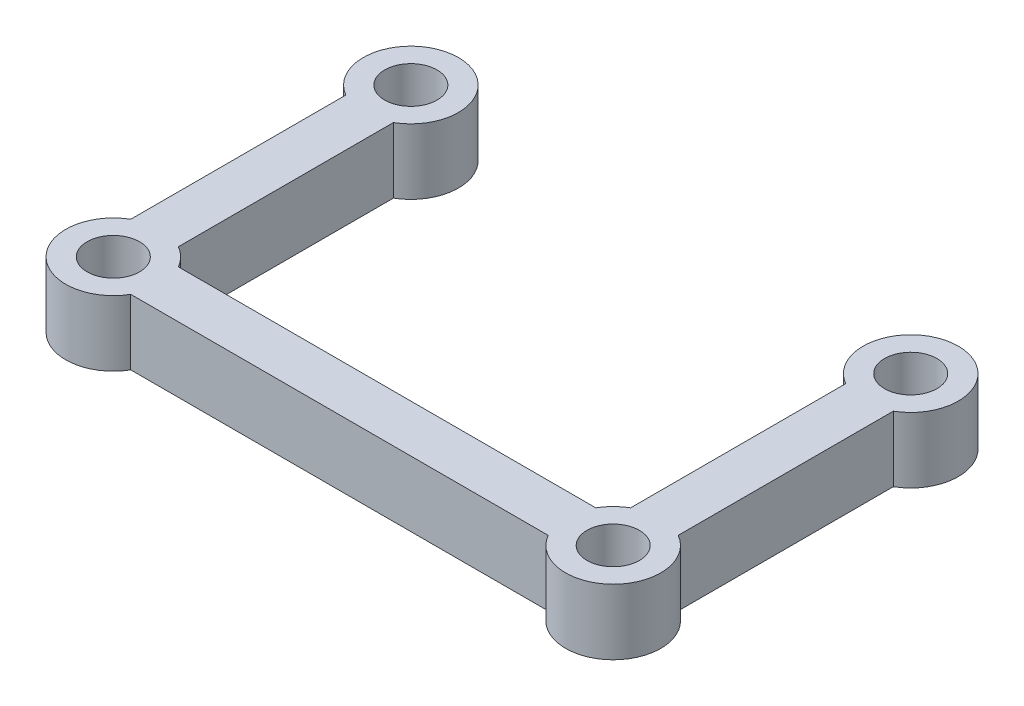
ISO-10303-21;
HEADER;
FILE_DESCRIPTION(('STEP AP214'),'2;1');
FILE_NAME('part.step','',(''),(''),'','','');
FILE_SCHEMA(('AUTOMOTIVE_DESIGN { 1 0 10303 214 1 1 1 1 }'));
ENDSEC;
DATA;
#1=APPLICATION_CONTEXT('core data for automotive mechanical design processes');
#2=APPLICATION_PROTOCOL_DEFINITION('international standard','automotive_design',2000,#1);
#3=PRODUCT_CONTEXT('',#1,'mechanical');
#4=PRODUCT('Part','Part','',(#3));
#5=PRODUCT_RELATED_PRODUCT_CATEGORY('part','',(#4));
#6=PRODUCT_DEFINITION_FORMATION('','',#4);
#7=PRODUCT_DEFINITION_CONTEXT('part definition',#1,'design');
#8=PRODUCT_DEFINITION('design','',#6,#7);
#9=PRODUCT_DEFINITION_SHAPE('','',#8);
#10=(LENGTH_UNIT() NAMED_UNIT(*) SI_UNIT(.MILLI.,.METRE.));
#11=(NAMED_UNIT(*) PLANE_ANGLE_UNIT() SI_UNIT($,.RADIAN.));
#12=(NAMED_UNIT(*) SI_UNIT($,.STERADIAN.) SOLID_ANGLE_UNIT());
#13=UNCERTAINTY_MEASURE_WITH_UNIT(LENGTH_MEASURE(1.E-05),#10,'distance_accuracy_value','');
#14=(GEOMETRIC_REPRESENTATION_CONTEXT(3) GLOBAL_UNCERTAINTY_ASSIGNED_CONTEXT((#13)) GLOBAL_UNIT_ASSIGNED_CONTEXT((#10,
#11,#12)) REPRESENTATION_CONTEXT('',''));
#15=CARTESIAN_POINT('',(0.,0.,0.));
#16=DIRECTION('',(0.,0.,1.));
#17=DIRECTION('',(1.,0.,0.));
#18=AXIS2_PLACEMENT_3D('',#15,#16,#17);
#19=CARTESIAN_POINT('',(-21.,2.75,0.));
#20=DIRECTION('',(0.,-1.,0.));
#21=DIRECTION('',(0.,0.,-1.));
#22=AXIS2_PLACEMENT_3D('',#19,#20,#21);
#23=CYLINDRICAL_SURFACE('',#22,2.);
#24=CARTESIAN_POINT('',(-21.,0.,0.));
#25=DIRECTION('',(0.,1.,0.));
#26=DIRECTION('',(0.,0.,1.));
#27=AXIS2_PLACEMENT_3D('',#24,#25,#26);
#28=CIRCLE('',#27,2.);
#29=CARTESIAN_POINT('',(-19.2679491924311,0.,-1.));
#30=VERTEX_POINT('',#29);
#31=CARTESIAN_POINT('',(-20.,0.,-1.73205080756887));
#32=VERTEX_POINT('',#31);
#33=EDGE_CURVE('E156',#30,#32,#28,.T.);
#34=ORIENTED_EDGE('',*,*,#33,.T.);
#35=DIRECTION('',(0.,-1.,0.));
#36=VECTOR('',#35,1.);
#37=CARTESIAN_POINT('',(-20.,2.75,-1.73205080756887));
#38=LINE('',#37,#36);
#39=CARTESIAN_POINT('',(-20.,2.75,-1.73205080756887));
#40=VERTEX_POINT('',#39);
#41=EDGE_CURVE('E11',#40,#32,#38,.T.);
#42=ORIENTED_EDGE('',*,*,#41,.F.);
#43=CARTESIAN_POINT('',(-21.,2.75,0.));
#44=DIRECTION('',(0.,1.,0.));
#45=DIRECTION('',(0.,0.,1.));
#46=AXIS2_PLACEMENT_3D('',#43,#44,#45);
#47=CIRCLE('',#46,2.);
#48=CARTESIAN_POINT('',(-19.2679491924311,2.75,-1.));
#49=VERTEX_POINT('',#48);
#50=EDGE_CURVE('E179',#49,#40,#47,.T.);
#51=ORIENTED_EDGE('',*,*,#50,.F.);
#52=DIRECTION('',(0.,-1.,0.));
#53=VECTOR('',#52,1.);
#54=CARTESIAN_POINT('',(-19.2679491924311,2.75,-1.));
#55=LINE('',#54,#53);
#56=EDGE_CURVE('E152',#49,#30,#55,.T.);
#57=ORIENTED_EDGE('',*,*,#56,.T.);
#58=EDGE_LOOP('',(#34,#42,#51,#57));
#59=FACE_BOUND('',#58,.T.);
#60=ADVANCED_FACE('F36',(#59),#23,.T.);
#61=CARTESIAN_POINT('',(-20.,2.75,-10.7679491924311));
#62=DIRECTION('',(-1.,0.,0.));
#63=DIRECTION('',(0.,0.,1.));
#64=AXIS2_PLACEMENT_3D('',#61,#62,#63);
#65=PLANE('',#64);
#66=DIRECTION('',(0.,0.,-1.));
#67=VECTOR('',#66,1.);
#68=CARTESIAN_POINT('',(-20.,0.,-10.7679491924311));
#69=LINE('',#68,#67);
#70=CARTESIAN_POINT('',(-20.,0.,-10.7679491924311));
#71=VERTEX_POINT('',#70);
#72=EDGE_CURVE('E159',#32,#71,#69,.T.);
#73=ORIENTED_EDGE('',*,*,#72,.T.);
#74=DIRECTION('',(0.,-1.,0.));
#75=VECTOR('',#74,1.);
#76=CARTESIAN_POINT('',(-20.,2.75,-10.7679491924311));
#77=LINE('',#76,#75);
#78=CARTESIAN_POINT('',(-20.,2.75,-10.7679491924311));
#79=VERTEX_POINT('',#78);
#80=EDGE_CURVE('E44',#79,#71,#77,.T.);
#81=ORIENTED_EDGE('',*,*,#80,.F.);
#82=DIRECTION('',(0.,0.,-1.));
#83=VECTOR('',#82,1.);
#84=CARTESIAN_POINT('',(-20.,2.75,-10.7679491924311));
#85=LINE('',#84,#83);
#86=EDGE_CURVE('E107',#40,#79,#85,.T.);
#87=ORIENTED_EDGE('',*,*,#86,.F.);
#88=ORIENTED_EDGE('',*,*,#41,.T.);
#89=EDGE_LOOP('',(#73,#81,#87,#88));
#90=FACE_BOUND('',#89,.T.);
#91=ADVANCED_FACE('F258',(#90),#65,.F.);
#92=CARTESIAN_POINT('',(-21.,2.75,-12.5));
#93=DIRECTION('',(0.,-1.,0.));
#94=DIRECTION('',(0.,0.,-1.));
#95=AXIS2_PLACEMENT_3D('',#92,#93,#94);
#96=CYLINDRICAL_SURFACE('',#95,2.);
#97=CARTESIAN_POINT('',(-21.,0.,-12.5));
#98=DIRECTION('',(0.,1.,0.));
#99=DIRECTION('',(0.,0.,1.));
#100=AXIS2_PLACEMENT_3D('',#97,#98,#99);
#101=CIRCLE('',#100,2.);
#102=CARTESIAN_POINT('',(-22.,0.,-10.7679491924311));
#103=VERTEX_POINT('',#102);
#104=EDGE_CURVE('E162',#71,#103,#101,.T.);
#105=ORIENTED_EDGE('',*,*,#104,.T.);
#106=DIRECTION('',(0.,-1.,0.));
#107=VECTOR('',#106,1.);
#108=CARTESIAN_POINT('',(-22.,2.75,-10.7679491924311));
#109=LINE('',#108,#107);
#110=CARTESIAN_POINT('',(-22.,2.75,-10.7679491924311));
#111=VERTEX_POINT('',#110);
#112=EDGE_CURVE('E198',#111,#103,#109,.T.);
#113=ORIENTED_EDGE('',*,*,#112,.F.);
#114=CARTESIAN_POINT('',(-21.,2.75,-12.5));
#115=DIRECTION('',(0.,1.,0.));
#116=DIRECTION('',(0.,0.,1.));
#117=AXIS2_PLACEMENT_3D('',#114,#115,#116);
#118=CIRCLE('',#117,2.);
#119=EDGE_CURVE('E206',#79,#111,#118,.T.);
#120=ORIENTED_EDGE('',*,*,#119,.F.);
#121=ORIENTED_EDGE('',*,*,#80,.T.);
#122=EDGE_LOOP('',(#105,#113,#120,#121));
#123=FACE_BOUND('',#122,.T.);
#124=ADVANCED_FACE('F204',(#123),#96,.T.);
#125=CARTESIAN_POINT('',(-22.,2.75,-10.7679491924311));
#126=DIRECTION('',(1.,0.,0.));
#127=DIRECTION('',(0.,0.,-1.));
#128=AXIS2_PLACEMENT_3D('',#125,#126,#127);
#129=PLANE('',#128);
#130=DIRECTION('',(0.,0.,1.));
#131=VECTOR('',#130,1.);
#132=CARTESIAN_POINT('',(-22.,0.,-10.7679491924311));
#133=LINE('',#132,#131);
#134=CARTESIAN_POINT('',(-22.,0.,-1.73205080756888));
#135=VERTEX_POINT('',#134);
#136=EDGE_CURVE('E164',#103,#135,#133,.T.);
#137=ORIENTED_EDGE('',*,*,#136,.T.);
#138=DIRECTION('',(0.,-1.,0.));
#139=VECTOR('',#138,1.);
#140=CARTESIAN_POINT('',(-22.,2.75,-1.73205080756888));
#141=LINE('',#140,#139);
#142=CARTESIAN_POINT('',(-22.,2.75,-1.73205080756888));
#143=VERTEX_POINT('',#142);
#144=EDGE_CURVE('E195',#143,#135,#141,.T.);
#145=ORIENTED_EDGE('',*,*,#144,.F.);
#146=DIRECTION('',(0.,0.,1.));
#147=VECTOR('',#146,1.);
#148=CARTESIAN_POINT('',(-22.,2.75,-10.7679491924311));
#149=LINE('',#148,#147);
#150=EDGE_CURVE('E224',#111,#143,#149,.T.);
#151=ORIENTED_EDGE('',*,*,#150,.F.);
#152=ORIENTED_EDGE('',*,*,#112,.T.);
#153=EDGE_LOOP('',(#137,#145,#151,#152));
#154=FACE_BOUND('',#153,.T.);
#155=ADVANCED_FACE('F215',(#154),#129,.F.);
#156=CARTESIAN_POINT('',(-21.,2.75,0.));
#157=DIRECTION('',(0.,-1.,0.));
#158=DIRECTION('',(0.,0.,-1.));
#159=AXIS2_PLACEMENT_3D('',#156,#157,#158);
#160=CYLINDRICAL_SURFACE('',#159,2.);
#161=CARTESIAN_POINT('',(-21.,0.,0.));
#162=DIRECTION('',(0.,1.,0.));
#163=DIRECTION('',(0.,0.,1.));
#164=AXIS2_PLACEMENT_3D('',#161,#162,#163);
#165=CIRCLE('',#164,2.);
#166=CARTESIAN_POINT('',(-19.2679491924311,0.,1.));
#167=VERTEX_POINT('',#166);
#168=EDGE_CURVE('E166',#135,#167,#165,.T.);
#169=ORIENTED_EDGE('',*,*,#168,.T.);
#170=DIRECTION('',(0.,-1.,0.));
#171=VECTOR('',#170,1.);
#172=CARTESIAN_POINT('',(-19.2679491924311,2.75,1.));
#173=LINE('',#172,#171);
#174=CARTESIAN_POINT('',(-19.2679491924311,2.75,1.));
#175=VERTEX_POINT('',#174);
#176=EDGE_CURVE('E192',#175,#167,#173,.T.);
#177=ORIENTED_EDGE('',*,*,#176,.F.);
#178=CARTESIAN_POINT('',(-21.,2.75,0.));
#179=DIRECTION('',(0.,1.,0.));
#180=DIRECTION('',(0.,0.,1.));
#181=AXIS2_PLACEMENT_3D('',#178,#179,#180);
#182=CIRCLE('',#181,2.);
#183=EDGE_CURVE('E221',#143,#175,#182,.T.);
#184=ORIENTED_EDGE('',*,*,#183,.F.);
#185=ORIENTED_EDGE('',*,*,#144,.T.);
#186=EDGE_LOOP('',(#169,#177,#184,#185));
#187=FACE_BOUND('',#186,.T.);
#188=ADVANCED_FACE('F219',(#187),#160,.T.);
#189=CARTESIAN_POINT('',(-19.2679491924311,2.75,1.));
#190=DIRECTION('',(0.,0.,-1.));
#191=DIRECTION('',(-1.,0.,0.));
#192=AXIS2_PLACEMENT_3D('',#189,#190,#191);
#193=PLANE('',#192);
#194=DIRECTION('',(1.,0.,0.));
#195=VECTOR('',#194,1.);
#196=CARTESIAN_POINT('',(-19.2679491924311,0.,1.));
#197=LINE('',#196,#195);
#198=CARTESIAN_POINT('',(-1.73205080756888,0.,0.999999999999999));
#199=VERTEX_POINT('',#198);
#200=EDGE_CURVE('E168',#167,#199,#197,.T.);
#201=ORIENTED_EDGE('',*,*,#200,.T.);
#202=DIRECTION('',(0.,-1.,0.));
#203=VECTOR('',#202,1.);
#204=CARTESIAN_POINT('',(-1.73205080756888,2.75,0.999999999999999));
#205=LINE('',#204,#203);
#206=CARTESIAN_POINT('',(-1.73205080756888,2.75,0.999999999999999));
#207=VERTEX_POINT('',#206);
#208=EDGE_CURVE('E189',#207,#199,#205,.T.);
#209=ORIENTED_EDGE('',*,*,#208,.F.);
#210=DIRECTION('',(1.,0.,0.));
#211=VECTOR('',#210,1.);
#212=CARTESIAN_POINT('',(-19.2679491924311,2.75,1.));
#213=LINE('',#212,#211);
#214=EDGE_CURVE('E223',#175,#207,#213,.T.);
#215=ORIENTED_EDGE('',*,*,#214,.F.);
#216=ORIENTED_EDGE('',*,*,#176,.T.);
#217=EDGE_LOOP('',(#201,#209,#215,#216));
#218=FACE_BOUND('',#217,.T.);
#219=ADVANCED_FACE('F271',(#218),#193,.F.);
#220=CARTESIAN_POINT('',(0.,2.75,0.));
#221=DIRECTION('',(0.,-1.,0.));
#222=DIRECTION('',(0.,0.,-1.));
#223=AXIS2_PLACEMENT_3D('',#220,#221,#222);
#224=CYLINDRICAL_SURFACE('',#223,2.);
#225=CARTESIAN_POINT('',(0.,0.,0.));
#226=DIRECTION('',(0.,1.,0.));
#227=DIRECTION('',(0.,0.,1.));
#228=AXIS2_PLACEMENT_3D('',#225,#226,#227);
#229=CIRCLE('',#228,2.);
#230=CARTESIAN_POINT('',(1.,0.,-1.73205080756888));
#231=VERTEX_POINT('',#230);
#232=EDGE_CURVE('E170',#199,#231,#229,.T.);
#233=ORIENTED_EDGE('',*,*,#232,.T.);
#234=DIRECTION('',(0.,-1.,0.));
#235=VECTOR('',#234,1.);
#236=CARTESIAN_POINT('',(1.,2.75,-1.73205080756888));
#237=LINE('',#236,#235);
#238=CARTESIAN_POINT('',(1.,2.75,-1.73205080756888));
#239=VERTEX_POINT('',#238);
#240=EDGE_CURVE('E186',#239,#231,#237,.T.);
#241=ORIENTED_EDGE('',*,*,#240,.F.);
#242=CARTESIAN_POINT('',(0.,2.75,0.));
#243=DIRECTION('',(0.,1.,0.));
#244=DIRECTION('',(0.,0.,1.));
#245=AXIS2_PLACEMENT_3D('',#242,#243,#244);
#246=CIRCLE('',#245,2.);
#247=EDGE_CURVE('E226',#207,#239,#246,.T.);
#248=ORIENTED_EDGE('',*,*,#247,.F.);
#249=ORIENTED_EDGE('',*,*,#208,.T.);
#250=EDGE_LOOP('',(#233,#241,#248,#249));
#251=FACE_BOUND('',#250,.T.);
#252=ADVANCED_FACE('F274',(#251),#224,.T.);
#253=CARTESIAN_POINT('',(1.,2.75,-10.7679491924311));
#254=DIRECTION('',(-1.,0.,0.));
#255=DIRECTION('',(0.,0.,1.));
#256=AXIS2_PLACEMENT_3D('',#253,#254,#255);
#257=PLANE('',#256);
#258=DIRECTION('',(0.,0.,-1.));
#259=VECTOR('',#258,1.);
#260=CARTESIAN_POINT('',(1.,0.,-10.7679491924311));
#261=LINE('',#260,#259);
#262=CARTESIAN_POINT('',(1.,0.,-10.7679491924311));
#263=VERTEX_POINT('',#262);
#264=EDGE_CURVE('E172',#231,#263,#261,.T.);
#265=ORIENTED_EDGE('',*,*,#264,.T.);
#266=DIRECTION('',(0.,-1.,0.));
#267=VECTOR('',#266,1.);
#268=CARTESIAN_POINT('',(1.,2.75,-10.7679491924311));
#269=LINE('',#268,#267);
#270=CARTESIAN_POINT('',(1.,2.75,-10.7679491924311));
#271=VERTEX_POINT('',#270);
#272=EDGE_CURVE('E183',#271,#263,#269,.T.);
#273=ORIENTED_EDGE('',*,*,#272,.F.);
#274=DIRECTION('',(0.,0.,-1.));
#275=VECTOR('',#274,1.);
#276=CARTESIAN_POINT('',(1.,2.75,-10.7679491924311));
#277=LINE('',#276,#275);
#278=EDGE_CURVE('E232',#239,#271,#277,.T.);
#279=ORIENTED_EDGE('',*,*,#278,.F.);
#280=ORIENTED_EDGE('',*,*,#240,.T.);
#281=EDGE_LOOP('',(#265,#273,#279,#280));
#282=FACE_BOUND('',#281,.T.);
#283=ADVANCED_FACE('F238',(#282),#257,.F.);
#284=CARTESIAN_POINT('',(0.,2.75,-12.5));
#285=DIRECTION('',(0.,-1.,0.));
#286=DIRECTION('',(0.,0.,-1.));
#287=AXIS2_PLACEMENT_3D('',#284,#285,#286);
#288=CYLINDRICAL_SURFACE('',#287,2.);
#289=CARTESIAN_POINT('',(0.,0.,-12.5));
#290=DIRECTION('',(0.,1.,0.));
#291=DIRECTION('',(0.,0.,1.));
#292=AXIS2_PLACEMENT_3D('',#289,#290,#291);
#293=CIRCLE('',#292,2.);
#294=CARTESIAN_POINT('',(-1.,0.,-10.7679491924311));
#295=VERTEX_POINT('',#294);
#296=EDGE_CURVE('E174',#263,#295,#293,.T.);
#297=ORIENTED_EDGE('',*,*,#296,.T.);
#298=DIRECTION('',(0.,-1.,0.));
#299=VECTOR('',#298,1.);
#300=CARTESIAN_POINT('',(-1.,2.75,-10.7679491924311));
#301=LINE('',#300,#299);
#302=CARTESIAN_POINT('',(-1.,2.75,-10.7679491924311));
#303=VERTEX_POINT('',#302);
#304=EDGE_CURVE('E147',#303,#295,#301,.T.);
#305=ORIENTED_EDGE('',*,*,#304,.F.);
#306=CARTESIAN_POINT('',(0.,2.75,-12.5));
#307=DIRECTION('',(0.,1.,0.));
#308=DIRECTION('',(0.,0.,1.));
#309=AXIS2_PLACEMENT_3D('',#306,#307,#308);
#310=CIRCLE('',#309,2.);
#311=EDGE_CURVE('E138',#271,#303,#310,.T.);
#312=ORIENTED_EDGE('',*,*,#311,.F.);
#313=ORIENTED_EDGE('',*,*,#272,.T.);
#314=EDGE_LOOP('',(#297,#305,#312,#313));
#315=FACE_BOUND('',#314,.T.);
#316=ADVANCED_FACE('F242',(#315),#288,.T.);
#317=CARTESIAN_POINT('',(-1.,2.75,-10.7679491924311));
#318=DIRECTION('',(1.,0.,0.));
#319=DIRECTION('',(0.,0.,-1.));
#320=AXIS2_PLACEMENT_3D('',#317,#318,#319);
#321=PLANE('',#320);
#322=DIRECTION('',(0.,0.,1.));
#323=VECTOR('',#322,1.);
#324=CARTESIAN_POINT('',(-1.,0.,-10.7679491924311));
#325=LINE('',#324,#323);
#326=CARTESIAN_POINT('',(-0.999999999999999,0.,-1.73205080756888));
#327=VERTEX_POINT('',#326);
#328=EDGE_CURVE('E146',#295,#327,#325,.T.);
#329=ORIENTED_EDGE('',*,*,#328,.T.);
#330=DIRECTION('',(0.,-1.,0.));
#331=VECTOR('',#330,1.);
#332=CARTESIAN_POINT('',(-0.999999999999999,2.75,-1.73205080756888));
#333=LINE('',#332,#331);
#334=CARTESIAN_POINT('',(-0.999999999999999,2.75,-1.73205080756888));
#335=VERTEX_POINT('',#334);
#336=EDGE_CURVE('E143',#335,#327,#333,.T.);
#337=ORIENTED_EDGE('',*,*,#336,.F.);
#338=DIRECTION('',(0.,0.,1.));
#339=VECTOR('',#338,1.);
#340=CARTESIAN_POINT('',(-1.,2.75,-10.7679491924311));
#341=LINE('',#340,#339);
#342=EDGE_CURVE('E132',#303,#335,#341,.T.);
#343=ORIENTED_EDGE('',*,*,#342,.F.);
#344=ORIENTED_EDGE('',*,*,#304,.T.);
#345=EDGE_LOOP('',(#329,#337,#343,#344));
#346=FACE_BOUND('',#345,.T.);
#347=ADVANCED_FACE('F144',(#346),#321,.F.);
#348=CARTESIAN_POINT('',(0.,2.75,0.));
#349=DIRECTION('',(0.,-1.,0.));
#350=DIRECTION('',(0.,0.,-1.));
#351=AXIS2_PLACEMENT_3D('',#348,#349,#350);
#352=CYLINDRICAL_SURFACE('',#351,2.);
#353=CARTESIAN_POINT('',(0.,0.,0.));
#354=DIRECTION('',(0.,1.,0.));
#355=DIRECTION('',(0.,0.,1.));
#356=AXIS2_PLACEMENT_3D('',#353,#354,#355);
#357=CIRCLE('',#356,2.);
#358=CARTESIAN_POINT('',(-1.73205080756888,0.,-1.));
#359=VERTEX_POINT('',#358);
#360=EDGE_CURVE('E93',#327,#359,#357,.T.);
#361=ORIENTED_EDGE('',*,*,#360,.T.);
#362=DIRECTION('',(0.,-1.,0.));
#363=VECTOR('',#362,1.);
#364=CARTESIAN_POINT('',(-1.73205080756888,2.75,-1.));
#365=LINE('',#364,#363);
#366=CARTESIAN_POINT('',(-1.73205080756888,2.75,-1.));
#367=VERTEX_POINT('',#366);
#368=EDGE_CURVE('E148',#367,#359,#365,.T.);
#369=ORIENTED_EDGE('',*,*,#368,.F.);
#370=CARTESIAN_POINT('',(0.,2.75,0.));
#371=DIRECTION('',(0.,1.,0.));
#372=DIRECTION('',(0.,0.,1.));
#373=AXIS2_PLACEMENT_3D('',#370,#371,#372);
#374=CIRCLE('',#373,2.);
#375=EDGE_CURVE('E136',#335,#367,#374,.T.);
#376=ORIENTED_EDGE('',*,*,#375,.F.);
#377=ORIENTED_EDGE('',*,*,#336,.T.);
#378=EDGE_LOOP('',(#361,#369,#376,#377));
#379=FACE_BOUND('',#378,.T.);
#380=ADVANCED_FACE('F150',(#379),#352,.T.);
#381=CARTESIAN_POINT('',(-19.2679491924311,2.75,-1.));
#382=DIRECTION('',(0.,0.,1.));
#383=DIRECTION('',(1.,0.,0.));
#384=AXIS2_PLACEMENT_3D('',#381,#382,#383);
#385=PLANE('',#384);
#386=DIRECTION('',(-1.,0.,0.));
#387=VECTOR('',#386,1.);
#388=CARTESIAN_POINT('',(-19.2679491924311,0.,-1.));
#389=LINE('',#388,#387);
#390=EDGE_CURVE('E99',#359,#30,#389,.T.);
#391=ORIENTED_EDGE('',*,*,#390,.T.);
#392=ORIENTED_EDGE('',*,*,#56,.F.);
#393=DIRECTION('',(-1.,0.,0.));
#394=VECTOR('',#393,1.);
#395=CARTESIAN_POINT('',(-19.2679491924311,2.75,-1.));
#396=LINE('',#395,#394);
#397=EDGE_CURVE('E52',#367,#49,#396,.T.);
#398=ORIENTED_EDGE('',*,*,#397,.F.);
#399=ORIENTED_EDGE('',*,*,#368,.T.);
#400=EDGE_LOOP('',(#391,#392,#398,#399));
#401=FACE_BOUND('',#400,.T.);
#402=ADVANCED_FACE('F246',(#401),#385,.F.);
#403=CARTESIAN_POINT('',(-21.,2.75,0.));
#404=DIRECTION('',(0.,1.,0.));
#405=DIRECTION('',(0.,0.,1.));
#406=AXIS2_PLACEMENT_3D('',#403,#404,#405);
#407=PLANE('',#406);
#408=CARTESIAN_POINT('',(-21.,2.75,0.));
#409=DIRECTION('',(0.,1.,0.));
#410=DIRECTION('',(0.,0.,1.));
#411=AXIS2_PLACEMENT_3D('',#408,#409,#410);
#412=CIRCLE('',#411,1.1);
#413=CARTESIAN_POINT('',(-21.,2.75,1.1));
#414=VERTEX_POINT('',#413);
#415=EDGE_CURVE('E357',#414,#414,#412,.T.);
#416=ORIENTED_EDGE('',*,*,#415,.F.);
#417=EDGE_LOOP('',(#416));
#418=FACE_BOUND('',#417,.T.);
#419=CARTESIAN_POINT('',(0.,2.75,0.));
#420=DIRECTION('',(0.,1.,0.));
#421=DIRECTION('',(0.,0.,1.));
#422=AXIS2_PLACEMENT_3D('',#419,#420,#421);
#423=CIRCLE('',#422,1.1);
#424=CARTESIAN_POINT('',(0.,2.75,1.1));
#425=VERTEX_POINT('',#424);
#426=EDGE_CURVE('E361',#425,#425,#423,.T.);
#427=ORIENTED_EDGE('',*,*,#426,.F.);
#428=EDGE_LOOP('',(#427));
#429=FACE_BOUND('',#428,.T.);
#430=CARTESIAN_POINT('',(0.,2.75,-12.5));
#431=DIRECTION('',(0.,1.,0.));
#432=DIRECTION('',(0.,0.,1.));
#433=AXIS2_PLACEMENT_3D('',#430,#431,#432);
#434=CIRCLE('',#433,1.1);
#435=CARTESIAN_POINT('',(0.,2.75,-11.4));
#436=VERTEX_POINT('',#435);
#437=EDGE_CURVE('E381',#436,#436,#434,.T.);
#438=ORIENTED_EDGE('',*,*,#437,.F.);
#439=EDGE_LOOP('',(#438));
#440=FACE_BOUND('',#439,.T.);
#441=CARTESIAN_POINT('',(-21.,2.75,-12.5));
#442=DIRECTION('',(0.,1.,0.));
#443=DIRECTION('',(0.,0.,1.));
#444=AXIS2_PLACEMENT_3D('',#441,#442,#443);
#445=CIRCLE('',#444,1.1);
#446=CARTESIAN_POINT('',(-21.,2.75,-11.4));
#447=VERTEX_POINT('',#446);
#448=EDGE_CURVE('E369',#447,#447,#445,.T.);
#449=ORIENTED_EDGE('',*,*,#448,.F.);
#450=EDGE_LOOP('',(#449));
#451=FACE_BOUND('',#450,.T.);
#452=ORIENTED_EDGE('',*,*,#50,.T.);
#453=ORIENTED_EDGE('',*,*,#86,.T.);
#454=ORIENTED_EDGE('',*,*,#119,.T.);
#455=ORIENTED_EDGE('',*,*,#150,.T.);
#456=ORIENTED_EDGE('',*,*,#183,.T.);
#457=ORIENTED_EDGE('',*,*,#214,.T.);
#458=ORIENTED_EDGE('',*,*,#247,.T.);
#459=ORIENTED_EDGE('',*,*,#278,.T.);
#460=ORIENTED_EDGE('',*,*,#311,.T.);
#461=ORIENTED_EDGE('',*,*,#342,.T.);
#462=ORIENTED_EDGE('',*,*,#375,.T.);
#463=ORIENTED_EDGE('',*,*,#397,.T.);
#464=EDGE_LOOP('',(#452,#453,#454,#455,#456,#457,#458,#459,#460,#461,#462,#463));
#465=FACE_BOUND('',#464,.T.);
#466=ADVANCED_FACE('F134',(#418,#429,#440,#451,#465),#407,.T.);
#467=CARTESIAN_POINT('',(-21.,0.,0.));
#468=DIRECTION('',(0.,1.,0.));
#469=DIRECTION('',(0.,0.,1.));
#470=AXIS2_PLACEMENT_3D('',#467,#468,#469);
#471=PLANE('',#470);
#472=CARTESIAN_POINT('',(-21.,0.,0.));
#473=DIRECTION('',(0.,1.,0.));
#474=DIRECTION('',(0.,0.,1.));
#475=AXIS2_PLACEMENT_3D('',#472,#473,#474);
#476=CIRCLE('',#475,1.1);
#477=CARTESIAN_POINT('',(-21.,0.,1.1));
#478=VERTEX_POINT('',#477);
#479=EDGE_CURVE('E360',#478,#478,#476,.F.);
#480=ORIENTED_EDGE('',*,*,#479,.F.);
#481=EDGE_LOOP('',(#480));
#482=FACE_BOUND('',#481,.T.);
#483=CARTESIAN_POINT('',(0.,0.,0.));
#484=DIRECTION('',(0.,1.,0.));
#485=DIRECTION('',(0.,0.,1.));
#486=AXIS2_PLACEMENT_3D('',#483,#484,#485);
#487=CIRCLE('',#486,1.1);
#488=CARTESIAN_POINT('',(0.,0.,1.1));
#489=VERTEX_POINT('',#488);
#490=EDGE_CURVE('E364',#489,#489,#487,.F.);
#491=ORIENTED_EDGE('',*,*,#490,.F.);
#492=EDGE_LOOP('',(#491));
#493=FACE_BOUND('',#492,.T.);
#494=CARTESIAN_POINT('',(0.,0.,-12.5));
#495=DIRECTION('',(0.,1.,0.));
#496=DIRECTION('',(0.,0.,1.));
#497=AXIS2_PLACEMENT_3D('',#494,#495,#496);
#498=CIRCLE('',#497,1.1);
#499=CARTESIAN_POINT('',(0.,0.,-11.4));
#500=VERTEX_POINT('',#499);
#501=EDGE_CURVE('E372',#500,#500,#498,.F.);
#502=ORIENTED_EDGE('',*,*,#501,.F.);
#503=EDGE_LOOP('',(#502));
#504=FACE_BOUND('',#503,.T.);
#505=CARTESIAN_POINT('',(-21.,0.,-12.5));
#506=DIRECTION('',(0.,1.,0.));
#507=DIRECTION('',(0.,0.,1.));
#508=AXIS2_PLACEMENT_3D('',#505,#506,#507);
#509=CIRCLE('',#508,1.1);
#510=CARTESIAN_POINT('',(-21.,0.,-11.4));
#511=VERTEX_POINT('',#510);
#512=EDGE_CURVE('E160',#511,#511,#509,.F.);
#513=ORIENTED_EDGE('',*,*,#512,.F.);
#514=EDGE_LOOP('',(#513));
#515=FACE_BOUND('',#514,.T.);
#516=ORIENTED_EDGE('',*,*,#33,.F.);
#517=ORIENTED_EDGE('',*,*,#390,.F.);
#518=ORIENTED_EDGE('',*,*,#360,.F.);
#519=ORIENTED_EDGE('',*,*,#328,.F.);
#520=ORIENTED_EDGE('',*,*,#296,.F.);
#521=ORIENTED_EDGE('',*,*,#264,.F.);
#522=ORIENTED_EDGE('',*,*,#232,.F.);
#523=ORIENTED_EDGE('',*,*,#200,.F.);
#524=ORIENTED_EDGE('',*,*,#168,.F.);
#525=ORIENTED_EDGE('',*,*,#136,.F.);
#526=ORIENTED_EDGE('',*,*,#104,.F.);
#527=ORIENTED_EDGE('',*,*,#72,.F.);
#528=EDGE_LOOP('',(#516,#517,#518,#519,#520,#521,#522,#523,#524,#525,#526,#527));
#529=FACE_BOUND('',#528,.T.);
#530=ADVANCED_FACE('F210',(#482,#493,#504,#515,#529),#471,.F.);
#531=CARTESIAN_POINT('',(-21.,-0.00100000000000013,-12.5));
#532=DIRECTION('',(0.,1.,0.));
#533=DIRECTION('',(0.,0.,1.));
#534=AXIS2_PLACEMENT_3D('',#531,#532,#533);
#535=CYLINDRICAL_SURFACE('',#534,1.1);
#536=ORIENTED_EDGE('',*,*,#448,.T.);
#537=EDGE_LOOP('',(#536));
#538=FACE_BOUND('',#537,.T.);
#539=ORIENTED_EDGE('',*,*,#512,.T.);
#540=EDGE_LOOP('',(#539));
#541=FACE_BOUND('',#540,.T.);
#542=ADVANCED_FACE('F311',(#538,#541),#535,.F.);
#543=CARTESIAN_POINT('',(0.,-0.00100000000000013,-12.5));
#544=DIRECTION('',(0.,1.,0.));
#545=DIRECTION('',(0.,0.,1.));
#546=AXIS2_PLACEMENT_3D('',#543,#544,#545);
#547=CYLINDRICAL_SURFACE('',#546,1.1);
#548=ORIENTED_EDGE('',*,*,#437,.T.);
#549=EDGE_LOOP('',(#548));
#550=FACE_BOUND('',#549,.T.);
#551=ORIENTED_EDGE('',*,*,#501,.T.);
#552=EDGE_LOOP('',(#551));
#553=FACE_BOUND('',#552,.T.);
#554=ADVANCED_FACE('F320',(#550,#553),#547,.F.);
#555=CARTESIAN_POINT('',(0.,-0.00100000000000013,0.));
#556=DIRECTION('',(0.,1.,0.));
#557=DIRECTION('',(0.,0.,1.));
#558=AXIS2_PLACEMENT_3D('',#555,#556,#557);
#559=CYLINDRICAL_SURFACE('',#558,1.1);
#560=ORIENTED_EDGE('',*,*,#426,.T.);
#561=EDGE_LOOP('',(#560));
#562=FACE_BOUND('',#561,.T.);
#563=ORIENTED_EDGE('',*,*,#490,.T.);
#564=EDGE_LOOP('',(#563));
#565=FACE_BOUND('',#564,.T.);
#566=ADVANCED_FACE('F330',(#562,#565),#559,.F.);
#567=CARTESIAN_POINT('',(-21.,-0.00100000000000013,0.));
#568=DIRECTION('',(0.,1.,0.));
#569=DIRECTION('',(0.,0.,1.));
#570=AXIS2_PLACEMENT_3D('',#567,#568,#569);
#571=CYLINDRICAL_SURFACE('',#570,1.1);
#572=ORIENTED_EDGE('',*,*,#415,.T.);
#573=EDGE_LOOP('',(#572));
#574=FACE_BOUND('',#573,.T.);
#575=ORIENTED_EDGE('',*,*,#479,.T.);
#576=EDGE_LOOP('',(#575));
#577=FACE_BOUND('',#576,.T.);
#578=ADVANCED_FACE('F340',(#574,#577),#571,.F.);
#579=CLOSED_SHELL('',(#60,#91,#124,#155,#188,#219,#252,#283,#316,#347,#380,#402,#466,#530,#542,
#554,#566,#578));
#580=MANIFOLD_SOLID_BREP('B2',#579);
#581=ADVANCED_BREP_SHAPE_REPRESENTATION('',(#18,#580),#14);
#582=SHAPE_DEFINITION_REPRESENTATION(#9,#581);
ENDSEC;
END-ISO-10303-21;
